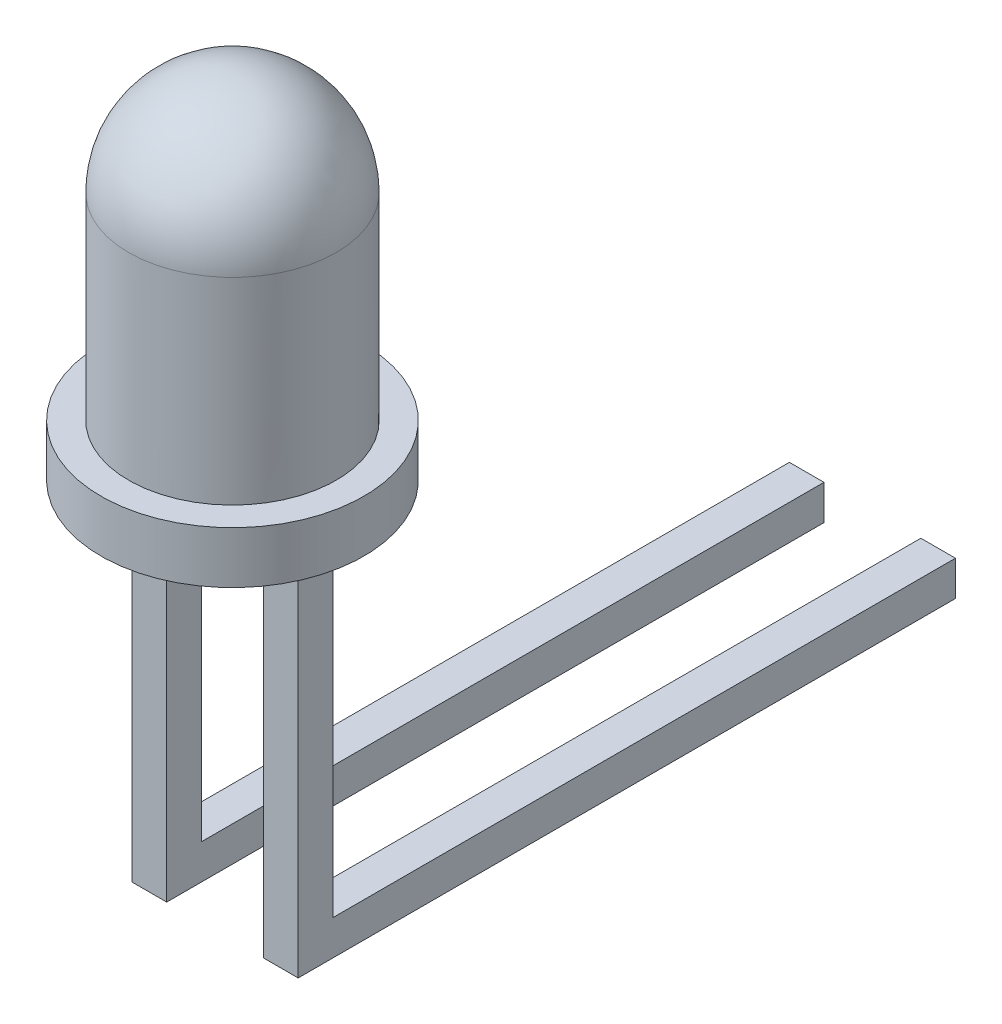
ISO-10303-21;
HEADER;
FILE_DESCRIPTION(('STEP AP214'),'2;1');
FILE_NAME('part.step','',(''),(''),'','','');
FILE_SCHEMA(('AUTOMOTIVE_DESIGN { 1 0 10303 214 1 1 1 1 }'));
ENDSEC;
DATA;
#1=APPLICATION_CONTEXT('core data for automotive mechanical design processes');
#2=APPLICATION_PROTOCOL_DEFINITION('international standard','automotive_design',2000,#1);
#3=PRODUCT_CONTEXT('',#1,'mechanical');
#4=PRODUCT('Part','Part','',(#3));
#5=PRODUCT_RELATED_PRODUCT_CATEGORY('part','',(#4));
#6=PRODUCT_DEFINITION_FORMATION('','',#4);
#7=PRODUCT_DEFINITION_CONTEXT('part definition',#1,'design');
#8=PRODUCT_DEFINITION('design','',#6,#7);
#9=PRODUCT_DEFINITION_SHAPE('','',#8);
#10=(LENGTH_UNIT() NAMED_UNIT(*) SI_UNIT(.MILLI.,.METRE.));
#11=(NAMED_UNIT(*) PLANE_ANGLE_UNIT() SI_UNIT($,.RADIAN.));
#12=(NAMED_UNIT(*) SI_UNIT($,.STERADIAN.) SOLID_ANGLE_UNIT());
#13=UNCERTAINTY_MEASURE_WITH_UNIT(LENGTH_MEASURE(1.E-05),#10,'distance_accuracy_value','');
#14=(GEOMETRIC_REPRESENTATION_CONTEXT(3) GLOBAL_UNCERTAINTY_ASSIGNED_CONTEXT((#13)) GLOBAL_UNIT_ASSIGNED_CONTEXT((#10,
#11,#12)) REPRESENTATION_CONTEXT('',''));
#15=CARTESIAN_POINT('',(0.,0.,0.));
#16=DIRECTION('',(0.,0.,1.));
#17=DIRECTION('',(1.,0.,0.));
#18=AXIS2_PLACEMENT_3D('',#15,#16,#17);
#19=CARTESIAN_POINT('',(0.,0.,-0.25));
#20=DIRECTION('',(0.,0.,-1.));
#21=DIRECTION('',(-1.,0.,0.));
#22=AXIS2_PLACEMENT_3D('',#19,#20,#21);
#23=PLANE('',#22);
#24=DIRECTION('',(0.,1.,0.));
#25=VECTOR('',#24,1.);
#26=CARTESIAN_POINT('',(1.2,2.46652278103782,-0.25));
#27=LINE('',#26,#25);
#28=CARTESIAN_POINT('',(1.2,-2.53367943829055,-0.25));
#29=VERTEX_POINT('',#28);
#30=CARTESIAN_POINT('',(1.2,2.46652278103782,-0.25));
#31=VERTEX_POINT('',#30);
#32=EDGE_CURVE('E170',#29,#31,#27,.T.);
#33=ORIENTED_EDGE('',*,*,#32,.F.);
#34=DIRECTION('',(1.,0.,0.));
#35=VECTOR('',#34,1.);
#36=CARTESIAN_POINT('',(0.700000000000001,-2.53367943829055,-0.25));
#37=LINE('',#36,#35);
#38=CARTESIAN_POINT('',(0.700000000000001,-2.53367943829055,-0.25));
#39=VERTEX_POINT('',#38);
#40=EDGE_CURVE('E142',#39,#29,#37,.T.);
#41=ORIENTED_EDGE('',*,*,#40,.F.);
#42=DIRECTION('',(0.,-1.,0.));
#43=VECTOR('',#42,1.);
#44=CARTESIAN_POINT('',(0.700000000000001,-3.03847721896218,-0.25));
#45=LINE('',#44,#43);
#46=CARTESIAN_POINT('',(0.700000000000001,2.46652278103782,-0.25));
#47=VERTEX_POINT('',#46);
#48=EDGE_CURVE('E147',#47,#39,#45,.T.);
#49=ORIENTED_EDGE('',*,*,#48,.F.);
#50=DIRECTION('',(-1.,0.,0.));
#51=VECTOR('',#50,1.);
#52=CARTESIAN_POINT('',(0.700000000000001,2.46652278103782,-0.25));
#53=LINE('',#52,#51);
#54=EDGE_CURVE('E180',#31,#47,#53,.T.);
#55=ORIENTED_EDGE('',*,*,#54,.F.);
#56=EDGE_LOOP('',(#33,#41,#49,#55));
#57=FACE_BOUND('',#56,.T.);
#58=ADVANCED_FACE('F34',(#57),#23,.T.);
#59=CARTESIAN_POINT('',(0.,0.,-0.25));
#60=DIRECTION('',(0.,0.,-1.));
#61=DIRECTION('',(-1.,0.,0.));
#62=AXIS2_PLACEMENT_3D('',#59,#60,#61);
#63=PLANE('',#62);
#64=DIRECTION('',(0.,1.,0.));
#65=VECTOR('',#64,1.);
#66=CARTESIAN_POINT('',(-0.699999999999999,2.46652278103782,-0.25));
#67=LINE('',#66,#65);
#68=CARTESIAN_POINT('',(-0.699999999999999,-2.53367943829055,-0.25));
#69=VERTEX_POINT('',#68);
#70=CARTESIAN_POINT('',(-0.699999999999999,2.46652278103782,-0.25));
#71=VERTEX_POINT('',#70);
#72=EDGE_CURVE('E194',#69,#71,#67,.T.);
#73=ORIENTED_EDGE('',*,*,#72,.F.);
#74=DIRECTION('',(1.,0.,0.));
#75=VECTOR('',#74,1.);
#76=CARTESIAN_POINT('',(-1.2,-2.53367943829055,-0.25));
#77=LINE('',#76,#75);
#78=CARTESIAN_POINT('',(-1.2,-2.53367943829055,-0.25));
#79=VERTEX_POINT('',#78);
#80=EDGE_CURVE('E148',#79,#69,#77,.T.);
#81=ORIENTED_EDGE('',*,*,#80,.F.);
#82=DIRECTION('',(0.,-1.,0.));
#83=VECTOR('',#82,1.);
#84=CARTESIAN_POINT('',(-1.2,-3.03847721896218,-0.25));
#85=LINE('',#84,#83);
#86=CARTESIAN_POINT('',(-1.2,2.46652278103782,-0.25));
#87=VERTEX_POINT('',#86);
#88=EDGE_CURVE('E203',#87,#79,#85,.T.);
#89=ORIENTED_EDGE('',*,*,#88,.F.);
#90=DIRECTION('',(-1.,0.,0.));
#91=VECTOR('',#90,1.);
#92=CARTESIAN_POINT('',(-0.699999999999999,2.46652278103782,-0.25));
#93=LINE('',#92,#91);
#94=EDGE_CURVE('E189',#71,#87,#93,.T.);
#95=ORIENTED_EDGE('',*,*,#94,.F.);
#96=EDGE_LOOP('',(#73,#81,#89,#95));
#97=FACE_BOUND('',#96,.T.);
#98=ADVANCED_FACE('F230',(#97),#63,.T.);
#99=CARTESIAN_POINT('',(-1.9,2.46652278103782,0.));
#100=DIRECTION('',(0.,-1.,0.));
#101=DIRECTION('',(1.,0.,0.));
#102=AXIS2_PLACEMENT_3D('',#99,#100,#101);
#103=PLANE('',#102);
#104=CARTESIAN_POINT('',(0.,2.46652278103782,0.));
#105=DIRECTION('',(0.,1.,0.));
#106=DIRECTION('',(-1.,0.,0.));
#107=AXIS2_PLACEMENT_3D('',#104,#105,#106);
#108=CIRCLE('',#107,1.9);
#109=CARTESIAN_POINT('',(-1.9,2.46652278103782,0.));
#110=VERTEX_POINT('',#109);
#111=EDGE_CURVE('E42',#110,#110,#108,.T.);
#112=ORIENTED_EDGE('',*,*,#111,.F.);
#113=EDGE_LOOP('',(#112));
#114=FACE_BOUND('',#113,.T.);
#115=DIRECTION('',(0.,0.,-1.));
#116=VECTOR('',#115,1.);
#117=CARTESIAN_POINT('',(-1.2,2.46652278103782,0.25));
#118=LINE('',#117,#116);
#119=CARTESIAN_POINT('',(-1.2,2.46652278103782,0.25));
#120=VERTEX_POINT('',#119);
#121=EDGE_CURVE('E213',#120,#87,#118,.T.);
#122=ORIENTED_EDGE('',*,*,#121,.F.);
#123=DIRECTION('',(-1.,0.,0.));
#124=VECTOR('',#123,1.);
#125=CARTESIAN_POINT('',(-0.699999999999999,2.46652278103782,0.25));
#126=LINE('',#125,#124);
#127=CARTESIAN_POINT('',(-0.699999999999999,2.46652278103782,0.25));
#128=VERTEX_POINT('',#127);
#129=EDGE_CURVE('E190',#128,#120,#126,.T.);
#130=ORIENTED_EDGE('',*,*,#129,.F.);
#131=DIRECTION('',(0.,0.,-1.));
#132=VECTOR('',#131,1.);
#133=CARTESIAN_POINT('',(-0.699999999999999,2.46652278103782,0.25));
#134=LINE('',#133,#132);
#135=EDGE_CURVE('E201',#128,#71,#134,.T.);
#136=ORIENTED_EDGE('',*,*,#135,.T.);
#137=ORIENTED_EDGE('',*,*,#94,.T.);
#138=EDGE_LOOP('',(#122,#130,#136,#137));
#139=FACE_BOUND('',#138,.T.);
#140=DIRECTION('',(0.,0.,-1.));
#141=VECTOR('',#140,1.);
#142=CARTESIAN_POINT('',(0.700000000000001,2.46652278103782,0.25));
#143=LINE('',#142,#141);
#144=CARTESIAN_POINT('',(0.700000000000001,2.46652278103782,0.25));
#145=VERTEX_POINT('',#144);
#146=EDGE_CURVE('E54',#145,#47,#143,.T.);
#147=ORIENTED_EDGE('',*,*,#146,.F.);
#148=DIRECTION('',(-1.,0.,0.));
#149=VECTOR('',#148,1.);
#150=CARTESIAN_POINT('',(0.700000000000001,2.46652278103782,0.25));
#151=LINE('',#150,#149);
#152=CARTESIAN_POINT('',(1.2,2.46652278103782,0.25));
#153=VERTEX_POINT('',#152);
#154=EDGE_CURVE('E49',#153,#145,#151,.T.);
#155=ORIENTED_EDGE('',*,*,#154,.F.);
#156=DIRECTION('',(0.,0.,-1.));
#157=VECTOR('',#156,1.);
#158=CARTESIAN_POINT('',(1.2,2.46652278103782,0.25));
#159=LINE('',#158,#157);
#160=EDGE_CURVE('E187',#153,#31,#159,.T.);
#161=ORIENTED_EDGE('',*,*,#160,.T.);
#162=ORIENTED_EDGE('',*,*,#54,.T.);
#163=EDGE_LOOP('',(#147,#155,#161,#162));
#164=FACE_BOUND('',#163,.T.);
#165=ADVANCED_FACE('F227',(#114,#139,#164),#103,.T.);
#166=CARTESIAN_POINT('',(-1.5,3.21652278103782,0.));
#167=DIRECTION('',(0.,1.,0.));
#168=DIRECTION('',(-1.,0.,0.));
#169=AXIS2_PLACEMENT_3D('',#166,#167,#168);
#170=PLANE('',#169);
#171=CARTESIAN_POINT('',(0.,3.21652278103782,0.));
#172=DIRECTION('',(0.,1.,0.));
#173=DIRECTION('',(-1.,0.,0.));
#174=AXIS2_PLACEMENT_3D('',#171,#172,#173);
#175=CIRCLE('',#174,1.9);
#176=CARTESIAN_POINT('',(-1.9,3.21652278103782,0.));
#177=VERTEX_POINT('',#176);
#178=EDGE_CURVE('E11',#177,#177,#175,.T.);
#179=ORIENTED_EDGE('',*,*,#178,.T.);
#180=EDGE_LOOP('',(#179));
#181=FACE_BOUND('',#180,.T.);
#182=CARTESIAN_POINT('',(0.,3.21652278103782,0.));
#183=DIRECTION('',(0.,1.,0.));
#184=DIRECTION('',(-1.,0.,0.));
#185=AXIS2_PLACEMENT_3D('',#182,#183,#184);
#186=CIRCLE('',#185,1.5);
#187=CARTESIAN_POINT('',(-1.5,3.21652278103782,0.));
#188=VERTEX_POINT('',#187);
#189=EDGE_CURVE('E216',#188,#188,#186,.T.);
#190=ORIENTED_EDGE('',*,*,#189,.F.);
#191=EDGE_LOOP('',(#190));
#192=FACE_BOUND('',#191,.T.);
#193=ADVANCED_FACE('F36',(#181,#192),#170,.T.);
#194=CARTESIAN_POINT('',(0.,7.56652278103782,0.));
#195=DIRECTION('',(0.,1.,0.));
#196=DIRECTION('',(-1.,0.,0.));
#197=AXIS2_PLACEMENT_3D('',#194,#195,#196);
#198=CYLINDRICAL_SURFACE('',#197,1.9);
#199=ORIENTED_EDGE('',*,*,#111,.T.);
#200=EDGE_LOOP('',(#199));
#201=FACE_BOUND('',#200,.T.);
#202=ORIENTED_EDGE('',*,*,#178,.F.);
#203=EDGE_LOOP('',(#202));
#204=FACE_BOUND('',#203,.T.);
#205=ADVANCED_FACE('F224',(#201,#204),#198,.T.);
#206=CARTESIAN_POINT('',(0.,6.06652278103782,0.));
#207=DIRECTION('',(0.,1.,0.));
#208=DIRECTION('',(1.,0.,0.));
#209=AXIS2_PLACEMENT_3D('',#206,#207,#208);
#210=SPHERICAL_SURFACE('',#209,1.5);
#211=CARTESIAN_POINT('',(0.,6.06652278103782,0.));
#212=DIRECTION('',(0.,1.,0.));
#213=DIRECTION('',(-1.,0.,0.));
#214=AXIS2_PLACEMENT_3D('',#211,#212,#213);
#215=CIRCLE('',#214,1.5);
#216=CARTESIAN_POINT('',(-1.5,6.06652278103782,0.));
#217=VERTEX_POINT('',#216);
#218=EDGE_CURVE('E219',#217,#217,#215,.T.);
#219=ORIENTED_EDGE('',*,*,#218,.T.);
#220=EDGE_LOOP('',(#219));
#221=FACE_BOUND('',#220,.T.);
#222=ADVANCED_FACE('F411',(#221),#210,.T.);
#223=CARTESIAN_POINT('',(0.,7.56652278103782,0.));
#224=DIRECTION('',(0.,1.,0.));
#225=DIRECTION('',(-1.,0.,0.));
#226=AXIS2_PLACEMENT_3D('',#223,#224,#225);
#227=CYLINDRICAL_SURFACE('',#226,1.5);
#228=ORIENTED_EDGE('',*,*,#189,.T.);
#229=EDGE_LOOP('',(#228));
#230=FACE_BOUND('',#229,.T.);
#231=ORIENTED_EDGE('',*,*,#218,.F.);
#232=EDGE_LOOP('',(#231));
#233=FACE_BOUND('',#232,.T.);
#234=ADVANCED_FACE('F267',(#230,#233),#227,.T.);
#235=CARTESIAN_POINT('',(-1.2,-3.03847721896218,0.25));
#236=DIRECTION('',(1.,0.,0.));
#237=DIRECTION('',(0.,0.,-1.));
#238=AXIS2_PLACEMENT_3D('',#235,#236,#237);
#239=PLANE('',#238);
#240=ORIENTED_EDGE('',*,*,#88,.T.);
#241=DIRECTION('',(0.,0.,1.));
#242=VECTOR('',#241,1.);
#243=CARTESIAN_POINT('',(-1.2,-2.53367943829055,-9.25));
#244=LINE('',#243,#242);
#245=CARTESIAN_POINT('',(-1.2,-2.53367943829055,-9.25));
#246=VERTEX_POINT('',#245);
#247=EDGE_CURVE('E168',#246,#79,#244,.T.);
#248=ORIENTED_EDGE('',*,*,#247,.F.);
#249=DIRECTION('',(0.,1.,0.));
#250=VECTOR('',#249,1.);
#251=CARTESIAN_POINT('',(-1.2,-3.03847721896218,-9.25));
#252=LINE('',#251,#250);
#253=CARTESIAN_POINT('',(-1.2,-3.03847721896218,-9.25));
#254=VERTEX_POINT('',#253);
#255=EDGE_CURVE('E150',#254,#246,#252,.T.);
#256=ORIENTED_EDGE('',*,*,#255,.F.);
#257=DIRECTION('',(0.,0.,-1.));
#258=VECTOR('',#257,1.);
#259=CARTESIAN_POINT('',(-1.2,-3.03847721896218,0.25));
#260=LINE('',#259,#258);
#261=CARTESIAN_POINT('',(-1.2,-3.03847721896218,0.25));
#262=VERTEX_POINT('',#261);
#263=EDGE_CURVE('E211',#262,#254,#260,.T.);
#264=ORIENTED_EDGE('',*,*,#263,.F.);
#265=DIRECTION('',(0.,-1.,0.));
#266=VECTOR('',#265,1.);
#267=CARTESIAN_POINT('',(-1.2,-3.03847721896218,0.25));
#268=LINE('',#267,#266);
#269=EDGE_CURVE('E193',#120,#262,#268,.T.);
#270=ORIENTED_EDGE('',*,*,#269,.F.);
#271=ORIENTED_EDGE('',*,*,#121,.T.);
#272=EDGE_LOOP('',(#240,#248,#256,#264,#270,#271));
#273=FACE_BOUND('',#272,.T.);
#274=ADVANCED_FACE('F237',(#273),#239,.F.);
#275=CARTESIAN_POINT('',(-0.699999999999999,-3.03847721896218,0.25));
#276=DIRECTION('',(0.,1.,0.));
#277=DIRECTION('',(0.,0.,1.));
#278=AXIS2_PLACEMENT_3D('',#275,#276,#277);
#279=PLANE('',#278);
#280=ORIENTED_EDGE('',*,*,#263,.T.);
#281=DIRECTION('',(-1.,0.,0.));
#282=VECTOR('',#281,1.);
#283=CARTESIAN_POINT('',(-1.2,-3.03847721896218,-9.25));
#284=LINE('',#283,#282);
#285=CARTESIAN_POINT('',(-0.699999999999999,-3.03847721896218,-9.25));
#286=VERTEX_POINT('',#285);
#287=EDGE_CURVE('E162',#286,#254,#284,.T.);
#288=ORIENTED_EDGE('',*,*,#287,.F.);
#289=DIRECTION('',(0.,0.,-1.));
#290=VECTOR('',#289,1.);
#291=CARTESIAN_POINT('',(-0.699999999999999,-3.03847721896218,0.25));
#292=LINE('',#291,#290);
#293=CARTESIAN_POINT('',(-0.699999999999999,-3.03847721896218,0.25));
#294=VERTEX_POINT('',#293);
#295=EDGE_CURVE('E209',#294,#286,#292,.T.);
#296=ORIENTED_EDGE('',*,*,#295,.F.);
#297=DIRECTION('',(1.,0.,0.));
#298=VECTOR('',#297,1.);
#299=CARTESIAN_POINT('',(-0.699999999999999,-3.03847721896218,0.25));
#300=LINE('',#299,#298);
#301=EDGE_CURVE('E196',#262,#294,#300,.T.);
#302=ORIENTED_EDGE('',*,*,#301,.F.);
#303=EDGE_LOOP('',(#280,#288,#296,#302));
#304=FACE_BOUND('',#303,.T.);
#305=ADVANCED_FACE('F259',(#304),#279,.F.);
#306=CARTESIAN_POINT('',(-0.699999999999999,2.46652278103782,0.25));
#307=DIRECTION('',(-1.,0.,0.));
#308=DIRECTION('',(0.,-1.,0.));
#309=AXIS2_PLACEMENT_3D('',#306,#307,#308);
#310=PLANE('',#309);
#311=ORIENTED_EDGE('',*,*,#295,.T.);
#312=DIRECTION('',(0.,-1.,0.));
#313=VECTOR('',#312,1.);
#314=CARTESIAN_POINT('',(-0.699999999999999,-3.03847721896218,-9.25));
#315=LINE('',#314,#313);
#316=CARTESIAN_POINT('',(-0.699999999999999,-2.53367943829055,-9.25));
#317=VERTEX_POINT('',#316);
#318=EDGE_CURVE('E159',#317,#286,#315,.T.);
#319=ORIENTED_EDGE('',*,*,#318,.F.);
#320=DIRECTION('',(0.,0.,1.));
#321=VECTOR('',#320,1.);
#322=CARTESIAN_POINT('',(-0.699999999999999,-2.53367943829055,-9.25));
#323=LINE('',#322,#321);
#324=EDGE_CURVE('E164',#317,#69,#323,.T.);
#325=ORIENTED_EDGE('',*,*,#324,.T.);
#326=ORIENTED_EDGE('',*,*,#72,.T.);
#327=ORIENTED_EDGE('',*,*,#135,.F.);
#328=DIRECTION('',(0.,1.,0.));
#329=VECTOR('',#328,1.);
#330=CARTESIAN_POINT('',(-0.699999999999999,2.46652278103782,0.25));
#331=LINE('',#330,#329);
#332=EDGE_CURVE('E198',#294,#128,#331,.T.);
#333=ORIENTED_EDGE('',*,*,#332,.F.);
#334=EDGE_LOOP('',(#311,#319,#325,#326,#327,#333));
#335=FACE_BOUND('',#334,.T.);
#336=ADVANCED_FACE('F246',(#335),#310,.F.);
#337=CARTESIAN_POINT('',(0.,0.,0.25));
#338=DIRECTION('',(0.,0.,-1.));
#339=DIRECTION('',(-1.,0.,0.));
#340=AXIS2_PLACEMENT_3D('',#337,#338,#339);
#341=PLANE('',#340);
#342=ORIENTED_EDGE('',*,*,#129,.T.);
#343=ORIENTED_EDGE('',*,*,#269,.T.);
#344=ORIENTED_EDGE('',*,*,#301,.T.);
#345=ORIENTED_EDGE('',*,*,#332,.T.);
#346=EDGE_LOOP('',(#342,#343,#344,#345));
#347=FACE_BOUND('',#346,.T.);
#348=ADVANCED_FACE('F241',(#347),#341,.F.);
#349=CARTESIAN_POINT('',(1.2,2.46652278103782,0.25));
#350=DIRECTION('',(-1.,0.,0.));
#351=DIRECTION('',(0.,-1.,0.));
#352=AXIS2_PLACEMENT_3D('',#349,#350,#351);
#353=PLANE('',#352);
#354=DIRECTION('',(0.,0.,-1.));
#355=VECTOR('',#354,1.);
#356=CARTESIAN_POINT('',(1.2,-3.03847721896218,0.25));
#357=LINE('',#356,#355);
#358=CARTESIAN_POINT('',(1.2,-3.03847721896218,0.25));
#359=VERTEX_POINT('',#358);
#360=CARTESIAN_POINT('',(1.2,-3.03847721896218,-9.25));
#361=VERTEX_POINT('',#360);
#362=EDGE_CURVE('E178',#359,#361,#357,.T.);
#363=ORIENTED_EDGE('',*,*,#362,.T.);
#364=DIRECTION('',(0.,-1.,0.));
#365=VECTOR('',#364,1.);
#366=CARTESIAN_POINT('',(1.2,-3.03847721896218,-9.25));
#367=LINE('',#366,#365);
#368=CARTESIAN_POINT('',(1.2,-2.53367943829055,-9.25));
#369=VERTEX_POINT('',#368);
#370=EDGE_CURVE('E132',#369,#361,#367,.T.);
#371=ORIENTED_EDGE('',*,*,#370,.F.);
#372=DIRECTION('',(0.,0.,1.));
#373=VECTOR('',#372,1.);
#374=CARTESIAN_POINT('',(1.2,-2.53367943829055,-9.25));
#375=LINE('',#374,#373);
#376=EDGE_CURVE('E128',#369,#29,#375,.T.);
#377=ORIENTED_EDGE('',*,*,#376,.T.);
#378=ORIENTED_EDGE('',*,*,#32,.T.);
#379=ORIENTED_EDGE('',*,*,#160,.F.);
#380=DIRECTION('',(0.,1.,0.));
#381=VECTOR('',#380,1.);
#382=CARTESIAN_POINT('',(1.2,2.46652278103782,0.25));
#383=LINE('',#382,#381);
#384=EDGE_CURVE('E171',#359,#153,#383,.T.);
#385=ORIENTED_EDGE('',*,*,#384,.F.);
#386=EDGE_LOOP('',(#363,#371,#377,#378,#379,#385));
#387=FACE_BOUND('',#386,.T.);
#388=ADVANCED_FACE('F287',(#387),#353,.F.);
#389=CARTESIAN_POINT('',(0.700000000000001,-3.03847721896218,0.25));
#390=DIRECTION('',(1.,0.,0.));
#391=DIRECTION('',(0.,1.,0.));
#392=AXIS2_PLACEMENT_3D('',#389,#390,#391);
#393=PLANE('',#392);
#394=ORIENTED_EDGE('',*,*,#48,.T.);
#395=DIRECTION('',(0.,0.,1.));
#396=VECTOR('',#395,1.);
#397=CARTESIAN_POINT('',(0.700000000000001,-2.53367943829055,-9.25));
#398=LINE('',#397,#396);
#399=CARTESIAN_POINT('',(0.700000000000001,-2.53367943829055,-9.25));
#400=VERTEX_POINT('',#399);
#401=EDGE_CURVE('E125',#400,#39,#398,.T.);
#402=ORIENTED_EDGE('',*,*,#401,.F.);
#403=DIRECTION('',(0.,1.,0.));
#404=VECTOR('',#403,1.);
#405=CARTESIAN_POINT('',(0.700000000000001,-3.03847721896218,-9.25));
#406=LINE('',#405,#404);
#407=CARTESIAN_POINT('',(0.700000000000001,-3.03847721896218,-9.25));
#408=VERTEX_POINT('',#407);
#409=EDGE_CURVE('E133',#408,#400,#406,.T.);
#410=ORIENTED_EDGE('',*,*,#409,.F.);
#411=DIRECTION('',(0.,0.,-1.));
#412=VECTOR('',#411,1.);
#413=CARTESIAN_POINT('',(0.700000000000001,-3.03847721896218,0.25));
#414=LINE('',#413,#412);
#415=CARTESIAN_POINT('',(0.700000000000001,-3.03847721896218,0.25));
#416=VERTEX_POINT('',#415);
#417=EDGE_CURVE('E184',#416,#408,#414,.T.);
#418=ORIENTED_EDGE('',*,*,#417,.F.);
#419=DIRECTION('',(0.,-1.,0.));
#420=VECTOR('',#419,1.);
#421=CARTESIAN_POINT('',(0.700000000000001,-3.03847721896218,0.25));
#422=LINE('',#421,#420);
#423=EDGE_CURVE('E174',#145,#416,#422,.T.);
#424=ORIENTED_EDGE('',*,*,#423,.F.);
#425=ORIENTED_EDGE('',*,*,#146,.T.);
#426=EDGE_LOOP('',(#394,#402,#410,#418,#424,#425));
#427=FACE_BOUND('',#426,.T.);
#428=ADVANCED_FACE('F145',(#427),#393,.F.);
#429=CARTESIAN_POINT('',(1.2,-3.03847721896218,0.25));
#430=DIRECTION('',(0.,1.,0.));
#431=DIRECTION('',(0.,0.,1.));
#432=AXIS2_PLACEMENT_3D('',#429,#430,#431);
#433=PLANE('',#432);
#434=ORIENTED_EDGE('',*,*,#417,.T.);
#435=DIRECTION('',(-1.,0.,0.));
#436=VECTOR('',#435,1.);
#437=CARTESIAN_POINT('',(0.700000000000001,-3.03847721896218,-9.25));
#438=LINE('',#437,#436);
#439=EDGE_CURVE('E139',#361,#408,#438,.T.);
#440=ORIENTED_EDGE('',*,*,#439,.F.);
#441=ORIENTED_EDGE('',*,*,#362,.F.);
#442=DIRECTION('',(1.,0.,0.));
#443=VECTOR('',#442,1.);
#444=CARTESIAN_POINT('',(1.2,-3.03847721896218,0.25));
#445=LINE('',#444,#443);
#446=EDGE_CURVE('E176',#416,#359,#445,.T.);
#447=ORIENTED_EDGE('',*,*,#446,.F.);
#448=EDGE_LOOP('',(#434,#440,#441,#447));
#449=FACE_BOUND('',#448,.T.);
#450=ADVANCED_FACE('F281',(#449),#433,.F.);
#451=CARTESIAN_POINT('',(0.,0.,0.25));
#452=DIRECTION('',(0.,0.,-1.));
#453=DIRECTION('',(-1.,0.,0.));
#454=AXIS2_PLACEMENT_3D('',#451,#452,#453);
#455=PLANE('',#454);
#456=ORIENTED_EDGE('',*,*,#384,.T.);
#457=ORIENTED_EDGE('',*,*,#154,.T.);
#458=ORIENTED_EDGE('',*,*,#423,.T.);
#459=ORIENTED_EDGE('',*,*,#446,.T.);
#460=EDGE_LOOP('',(#456,#457,#458,#459));
#461=FACE_BOUND('',#460,.T.);
#462=ADVANCED_FACE('F279',(#461),#455,.F.);
#463=CARTESIAN_POINT('',(-1.2,-2.53367943829055,-9.25));
#464=DIRECTION('',(0.,-1.,0.));
#465=DIRECTION('',(0.,0.,-1.));
#466=AXIS2_PLACEMENT_3D('',#463,#464,#465);
#467=PLANE('',#466);
#468=ORIENTED_EDGE('',*,*,#80,.T.);
#469=ORIENTED_EDGE('',*,*,#324,.F.);
#470=DIRECTION('',(1.,0.,0.));
#471=VECTOR('',#470,1.);
#472=CARTESIAN_POINT('',(-1.2,-2.53367943829055,-9.25));
#473=LINE('',#472,#471);
#474=EDGE_CURVE('E157',#246,#317,#473,.T.);
#475=ORIENTED_EDGE('',*,*,#474,.F.);
#476=ORIENTED_EDGE('',*,*,#247,.T.);
#477=EDGE_LOOP('',(#468,#469,#475,#476));
#478=FACE_BOUND('',#477,.T.);
#479=ADVANCED_FACE('F252',(#478),#467,.F.);
#480=CARTESIAN_POINT('',(0.,0.,-9.25));
#481=DIRECTION('',(0.,0.,-1.));
#482=DIRECTION('',(-1.,0.,0.));
#483=AXIS2_PLACEMENT_3D('',#480,#481,#482);
#484=PLANE('',#483);
#485=ORIENTED_EDGE('',*,*,#255,.T.);
#486=ORIENTED_EDGE('',*,*,#474,.T.);
#487=ORIENTED_EDGE('',*,*,#318,.T.);
#488=ORIENTED_EDGE('',*,*,#287,.T.);
#489=EDGE_LOOP('',(#485,#486,#487,#488));
#490=FACE_BOUND('',#489,.T.);
#491=ADVANCED_FACE('F256',(#490),#484,.T.);
#492=CARTESIAN_POINT('',(0.700000000000001,-2.53367943829055,-9.25));
#493=DIRECTION('',(0.,-1.,0.));
#494=DIRECTION('',(0.,0.,-1.));
#495=AXIS2_PLACEMENT_3D('',#492,#493,#494);
#496=PLANE('',#495);
#497=ORIENTED_EDGE('',*,*,#40,.T.);
#498=ORIENTED_EDGE('',*,*,#376,.F.);
#499=DIRECTION('',(1.,0.,0.));
#500=VECTOR('',#499,1.);
#501=CARTESIAN_POINT('',(0.700000000000001,-2.53367943829055,-9.25));
#502=LINE('',#501,#500);
#503=EDGE_CURVE('E121',#400,#369,#502,.T.);
#504=ORIENTED_EDGE('',*,*,#503,.F.);
#505=ORIENTED_EDGE('',*,*,#401,.T.);
#506=EDGE_LOOP('',(#497,#498,#504,#505));
#507=FACE_BOUND('',#506,.T.);
#508=ADVANCED_FACE('F123',(#507),#496,.F.);
#509=CARTESIAN_POINT('',(0.,0.,-9.25));
#510=DIRECTION('',(0.,0.,-1.));
#511=DIRECTION('',(-1.,0.,0.));
#512=AXIS2_PLACEMENT_3D('',#509,#510,#511);
#513=PLANE('',#512);
#514=ORIENTED_EDGE('',*,*,#409,.T.);
#515=ORIENTED_EDGE('',*,*,#503,.T.);
#516=ORIENTED_EDGE('',*,*,#370,.T.);
#517=ORIENTED_EDGE('',*,*,#439,.T.);
#518=EDGE_LOOP('',(#514,#515,#516,#517));
#519=FACE_BOUND('',#518,.T.);
#520=ADVANCED_FACE('F137',(#519),#513,.T.);
#521=CLOSED_SHELL('',(#58,#98,#165,#193,#205,#222,#234,#274,#305,#336,#348,#388,#428,#450,#462,
#479,#491,#508,#520));
#522=MANIFOLD_SOLID_BREP('B2',#521);
#523=ADVANCED_BREP_SHAPE_REPRESENTATION('',(#18,#522),#14);
#524=SHAPE_DEFINITION_REPRESENTATION(#9,#523);
ENDSEC;
END-ISO-10303-21;
